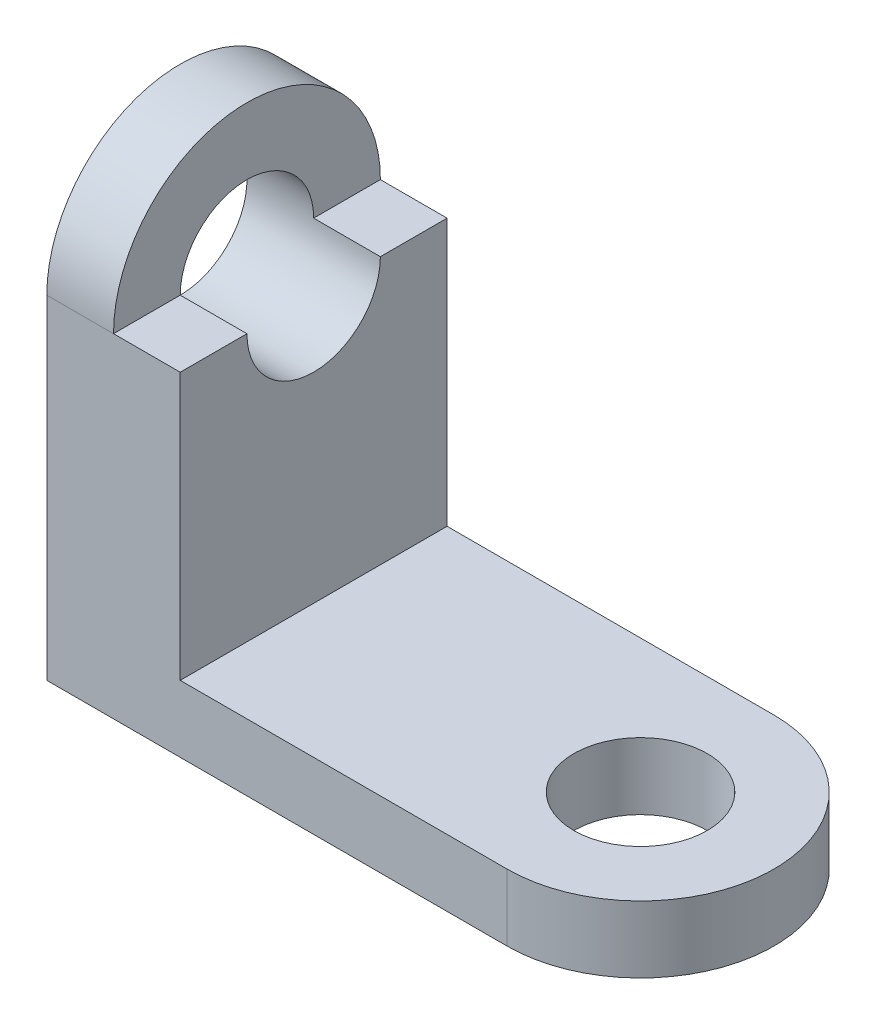
ISO-10303-21;
HEADER;
FILE_DESCRIPTION(('STEP AP214'),'2;1');
FILE_NAME('part.step','',(''),(''),'','','');
FILE_SCHEMA(('AUTOMOTIVE_DESIGN { 1 0 10303 214 1 1 1 1 }'));
ENDSEC;
DATA;
#1=APPLICATION_CONTEXT('core data for automotive mechanical design processes');
#2=APPLICATION_PROTOCOL_DEFINITION('international standard','automotive_design',2000,#1);
#3=PRODUCT_CONTEXT('',#1,'mechanical');
#4=PRODUCT('Part','Part','',(#3));
#5=PRODUCT_RELATED_PRODUCT_CATEGORY('part','',(#4));
#6=PRODUCT_DEFINITION_FORMATION('','',#4);
#7=PRODUCT_DEFINITION_CONTEXT('part definition',#1,'design');
#8=PRODUCT_DEFINITION('design','',#6,#7);
#9=PRODUCT_DEFINITION_SHAPE('','',#8);
#10=(LENGTH_UNIT() NAMED_UNIT(*) SI_UNIT(.MILLI.,.METRE.));
#11=(NAMED_UNIT(*) PLANE_ANGLE_UNIT() SI_UNIT($,.RADIAN.));
#12=(NAMED_UNIT(*) SI_UNIT($,.STERADIAN.) SOLID_ANGLE_UNIT());
#13=UNCERTAINTY_MEASURE_WITH_UNIT(LENGTH_MEASURE(1.E-05),#10,'distance_accuracy_value','');
#14=(GEOMETRIC_REPRESENTATION_CONTEXT(3) GLOBAL_UNCERTAINTY_ASSIGNED_CONTEXT((#13)) GLOBAL_UNIT_ASSIGNED_CONTEXT((#10,
#11,#12)) REPRESENTATION_CONTEXT('',''));
#15=CARTESIAN_POINT('',(0.,0.,0.));
#16=DIRECTION('',(0.,0.,1.));
#17=DIRECTION('',(1.,0.,0.));
#18=AXIS2_PLACEMENT_3D('',#15,#16,#17);
#19=CARTESIAN_POINT('',(254.,0.,0.));
#20=DIRECTION('',(-1.,0.,0.));
#21=DIRECTION('',(0.,0.,1.));
#22=AXIS2_PLACEMENT_3D('',#19,#20,#21);
#23=PLANE('',#22);
#24=DIRECTION('',(0.,0.,1.));
#25=VECTOR('',#24,1.);
#26=CARTESIAN_POINT('',(254.,1270.,-1016.));
#27=LINE('',#26,#25);
#28=CARTESIAN_POINT('',(254.,1270.,-1016.));
#29=VERTEX_POINT('',#28);
#30=CARTESIAN_POINT('',(254.,1270.,-762.));
#31=VERTEX_POINT('',#30);
#32=EDGE_CURVE('E137',#29,#31,#27,.T.);
#33=ORIENTED_EDGE('',*,*,#32,.F.);
#34=CARTESIAN_POINT('',(254.,1270.,-508.));
#35=DIRECTION('',(-1.,0.,0.));
#36=DIRECTION('',(0.,0.,1.));
#37=AXIS2_PLACEMENT_3D('',#34,#35,#36);
#38=CIRCLE('',#37,508.);
#39=CARTESIAN_POINT('',(254.,1270.,0.));
#40=VERTEX_POINT('',#39);
#41=EDGE_CURVE('E151',#29,#40,#38,.F.);
#42=ORIENTED_EDGE('',*,*,#41,.T.);
#43=DIRECTION('',(0.,0.,1.));
#44=VECTOR('',#43,1.);
#45=CARTESIAN_POINT('',(254.,1270.,0.));
#46=LINE('',#45,#44);
#47=CARTESIAN_POINT('',(254.,1270.,-254.));
#48=VERTEX_POINT('',#47);
#49=EDGE_CURVE('E139',#48,#40,#46,.T.);
#50=ORIENTED_EDGE('',*,*,#49,.F.);
#51=CARTESIAN_POINT('',(254.,1270.,-508.));
#52=DIRECTION('',(-1.,0.,0.));
#53=DIRECTION('',(0.,0.,1.));
#54=AXIS2_PLACEMENT_3D('',#51,#52,#53);
#55=CIRCLE('',#54,254.);
#56=EDGE_CURVE('E149',#48,#31,#55,.T.);
#57=ORIENTED_EDGE('',*,*,#56,.T.);
#58=EDGE_LOOP('',(#33,#42,#50,#57));
#59=FACE_BOUND('',#58,.T.);
#60=ADVANCED_FACE('F37',(#59),#23,.F.);
#61=CARTESIAN_POINT('',(1752.6,254.,-508.));
#62=DIRECTION('',(0.,-1.,0.));
#63=DIRECTION('',(0.,0.,-1.));
#64=AXIS2_PLACEMENT_3D('',#61,#62,#63);
#65=PLANE('',#64);
#66=CARTESIAN_POINT('',(1752.6,254.,-508.));
#67=DIRECTION('',(0.,1.,0.));
#68=DIRECTION('',(0.,0.,1.));
#69=AXIS2_PLACEMENT_3D('',#66,#67,#68);
#70=CIRCLE('',#69,254.);
#71=CARTESIAN_POINT('',(1752.6,254.,-254.));
#72=VERTEX_POINT('',#71);
#73=EDGE_CURVE('E164',#72,#72,#70,.T.);
#74=ORIENTED_EDGE('',*,*,#73,.F.);
#75=EDGE_LOOP('',(#74));
#76=FACE_BOUND('',#75,.T.);
#77=DIRECTION('',(-1.,0.,0.));
#78=VECTOR('',#77,1.);
#79=CARTESIAN_POINT('',(0.,254.,-1016.));
#80=LINE('',#79,#78);
#81=CARTESIAN_POINT('',(1752.6,254.,-1016.));
#82=VERTEX_POINT('',#81);
#83=CARTESIAN_POINT('',(508.,254.,-1016.));
#84=VERTEX_POINT('',#83);
#85=EDGE_CURVE('E57',#82,#84,#80,.T.);
#86=ORIENTED_EDGE('',*,*,#85,.T.);
#87=DIRECTION('',(0.,0.,-1.));
#88=VECTOR('',#87,1.);
#89=CARTESIAN_POINT('',(508.,254.,0.));
#90=LINE('',#89,#88);
#91=CARTESIAN_POINT('',(508.,254.,0.));
#92=VERTEX_POINT('',#91);
#93=EDGE_CURVE('E52',#92,#84,#90,.T.);
#94=ORIENTED_EDGE('',*,*,#93,.F.);
#95=DIRECTION('',(1.,0.,0.));
#96=VECTOR('',#95,1.);
#97=CARTESIAN_POINT('',(0.,254.,0.));
#98=LINE('',#97,#96);
#99=CARTESIAN_POINT('',(1752.6,254.,0.));
#100=VERTEX_POINT('',#99);
#101=EDGE_CURVE('E170',#92,#100,#98,.T.);
#102=ORIENTED_EDGE('',*,*,#101,.T.);
#103=CARTESIAN_POINT('',(1752.6,254.,-508.));
#104=DIRECTION('',(0.,1.,0.));
#105=DIRECTION('',(0.,0.,-1.));
#106=AXIS2_PLACEMENT_3D('',#103,#104,#105);
#107=CIRCLE('',#106,508.);
#108=EDGE_CURVE('E172',#100,#82,#107,.T.);
#109=ORIENTED_EDGE('',*,*,#108,.T.);
#110=EDGE_LOOP('',(#86,#94,#102,#109));
#111=FACE_BOUND('',#110,.T.);
#112=ADVANCED_FACE('F218',(#76,#111),#65,.F.);
#113=CARTESIAN_POINT('',(1752.6,0.,-508.));
#114=DIRECTION('',(0.,-1.,0.));
#115=DIRECTION('',(0.,0.,-1.));
#116=AXIS2_PLACEMENT_3D('',#113,#114,#115);
#117=PLANE('',#116);
#118=DIRECTION('',(1.,0.,0.));
#119=VECTOR('',#118,1.);
#120=CARTESIAN_POINT('',(0.,0.,0.));
#121=LINE('',#120,#119);
#122=CARTESIAN_POINT('',(0.,0.,0.));
#123=VERTEX_POINT('',#122);
#124=CARTESIAN_POINT('',(1752.6,0.,0.));
#125=VERTEX_POINT('',#124);
#126=EDGE_CURVE('E167',#123,#125,#121,.T.);
#127=ORIENTED_EDGE('',*,*,#126,.F.);
#128=DIRECTION('',(0.,0.,1.));
#129=VECTOR('',#128,1.);
#130=CARTESIAN_POINT('',(0.,0.,0.));
#131=LINE('',#130,#129);
#132=CARTESIAN_POINT('',(0.,0.,-1016.));
#133=VERTEX_POINT('',#132);
#134=EDGE_CURVE('E173',#133,#123,#131,.T.);
#135=ORIENTED_EDGE('',*,*,#134,.F.);
#136=DIRECTION('',(-1.,0.,0.));
#137=VECTOR('',#136,1.);
#138=CARTESIAN_POINT('',(0.,0.,-1016.));
#139=LINE('',#138,#137);
#140=CARTESIAN_POINT('',(1752.6,0.,-1016.));
#141=VERTEX_POINT('',#140);
#142=EDGE_CURVE('E181',#141,#133,#139,.T.);
#143=ORIENTED_EDGE('',*,*,#142,.F.);
#144=CARTESIAN_POINT('',(1752.6,0.,-508.));
#145=DIRECTION('',(0.,1.,0.));
#146=DIRECTION('',(0.,0.,-1.));
#147=AXIS2_PLACEMENT_3D('',#144,#145,#146);
#148=CIRCLE('',#147,508.);
#149=EDGE_CURVE('E179',#125,#141,#148,.T.);
#150=ORIENTED_EDGE('',*,*,#149,.F.);
#151=EDGE_LOOP('',(#127,#135,#143,#150));
#152=FACE_BOUND('',#151,.T.);
#153=CARTESIAN_POINT('',(1752.6,0.,-508.));
#154=DIRECTION('',(0.,1.,0.));
#155=DIRECTION('',(0.,0.,1.));
#156=AXIS2_PLACEMENT_3D('',#153,#154,#155);
#157=CIRCLE('',#156,254.);
#158=CARTESIAN_POINT('',(1752.6,0.,-254.));
#159=VERTEX_POINT('',#158);
#160=EDGE_CURVE('E162',#159,#159,#157,.T.);
#161=ORIENTED_EDGE('',*,*,#160,.T.);
#162=EDGE_LOOP('',(#161));
#163=FACE_BOUND('',#162,.T.);
#164=ADVANCED_FACE('F196',(#152,#163),#117,.T.);
#165=CARTESIAN_POINT('',(0.,254.,0.));
#166=DIRECTION('',(0.,0.,-1.));
#167=DIRECTION('',(-1.,0.,0.));
#168=AXIS2_PLACEMENT_3D('',#165,#166,#167);
#169=PLANE('',#168);
#170=ORIENTED_EDGE('',*,*,#101,.F.);
#171=DIRECTION('',(0.,-1.,0.));
#172=VECTOR('',#171,1.);
#173=CARTESIAN_POINT('',(508.,1270.,0.));
#174=LINE('',#173,#172);
#175=CARTESIAN_POINT('',(508.,1270.,0.));
#176=VERTEX_POINT('',#175);
#177=EDGE_CURVE('E142',#176,#92,#174,.T.);
#178=ORIENTED_EDGE('',*,*,#177,.F.);
#179=DIRECTION('',(-1.,0.,0.));
#180=VECTOR('',#179,1.);
#181=CARTESIAN_POINT('',(508.,1270.,0.));
#182=LINE('',#181,#180);
#183=EDGE_CURVE('E136',#176,#40,#182,.T.);
#184=ORIENTED_EDGE('',*,*,#183,.T.);
#185=DIRECTION('',(-1.,0.,0.));
#186=VECTOR('',#185,1.);
#187=CARTESIAN_POINT('',(254.,1270.,0.));
#188=LINE('',#187,#186);
#189=CARTESIAN_POINT('',(0.,1270.,0.));
#190=VERTEX_POINT('',#189);
#191=EDGE_CURVE('E159',#40,#190,#188,.T.);
#192=ORIENTED_EDGE('',*,*,#191,.T.);
#193=DIRECTION('',(0.,-1.,0.));
#194=VECTOR('',#193,1.);
#195=CARTESIAN_POINT('',(0.,254.,0.));
#196=LINE('',#195,#194);
#197=EDGE_CURVE('E176',#190,#123,#196,.T.);
#198=ORIENTED_EDGE('',*,*,#197,.T.);
#199=ORIENTED_EDGE('',*,*,#126,.T.);
#200=DIRECTION('',(0.,-1.,0.));
#201=VECTOR('',#200,1.);
#202=CARTESIAN_POINT('',(1752.6,254.,0.));
#203=LINE('',#202,#201);
#204=EDGE_CURVE('E11',#100,#125,#203,.T.);
#205=ORIENTED_EDGE('',*,*,#204,.F.);
#206=EDGE_LOOP('',(#170,#178,#184,#192,#198,#199,#205));
#207=FACE_BOUND('',#206,.T.);
#208=ADVANCED_FACE('F39',(#207),#169,.F.);
#209=CARTESIAN_POINT('',(1752.6,254.,-508.));
#210=DIRECTION('',(0.,-1.,0.));
#211=DIRECTION('',(0.,0.,-1.));
#212=AXIS2_PLACEMENT_3D('',#209,#210,#211);
#213=CYLINDRICAL_SURFACE('',#212,508.);
#214=ORIENTED_EDGE('',*,*,#149,.T.);
#215=DIRECTION('',(0.,-1.,0.));
#216=VECTOR('',#215,1.);
#217=CARTESIAN_POINT('',(1752.6,254.,-1016.));
#218=LINE('',#217,#216);
#219=EDGE_CURVE('E45',#82,#141,#218,.T.);
#220=ORIENTED_EDGE('',*,*,#219,.F.);
#221=ORIENTED_EDGE('',*,*,#108,.F.);
#222=ORIENTED_EDGE('',*,*,#204,.T.);
#223=EDGE_LOOP('',(#214,#220,#221,#222));
#224=FACE_BOUND('',#223,.T.);
#225=ADVANCED_FACE('F219',(#224),#213,.T.);
#226=CARTESIAN_POINT('',(0.,254.,-1016.));
#227=DIRECTION('',(0.,0.,1.));
#228=DIRECTION('',(1.,0.,0.));
#229=AXIS2_PLACEMENT_3D('',#226,#227,#228);
#230=PLANE('',#229);
#231=ORIENTED_EDGE('',*,*,#142,.T.);
#232=DIRECTION('',(0.,-1.,0.));
#233=VECTOR('',#232,1.);
#234=CARTESIAN_POINT('',(0.,254.,-1016.));
#235=LINE('',#234,#233);
#236=CARTESIAN_POINT('',(0.,1270.,-1016.));
#237=VERTEX_POINT('',#236);
#238=EDGE_CURVE('E186',#237,#133,#235,.T.);
#239=ORIENTED_EDGE('',*,*,#238,.F.);
#240=DIRECTION('',(-1.,0.,0.));
#241=VECTOR('',#240,1.);
#242=CARTESIAN_POINT('',(254.,1270.,-1016.));
#243=LINE('',#242,#241);
#244=EDGE_CURVE('E119',#29,#237,#243,.T.);
#245=ORIENTED_EDGE('',*,*,#244,.F.);
#246=DIRECTION('',(-1.,0.,0.));
#247=VECTOR('',#246,1.);
#248=CARTESIAN_POINT('',(508.,1270.,-1016.));
#249=LINE('',#248,#247);
#250=CARTESIAN_POINT('',(508.,1270.,-1016.));
#251=VERTEX_POINT('',#250);
#252=EDGE_CURVE('E116',#251,#29,#249,.T.);
#253=ORIENTED_EDGE('',*,*,#252,.F.);
#254=DIRECTION('',(0.,1.,0.));
#255=VECTOR('',#254,1.);
#256=CARTESIAN_POINT('',(508.,254.,-1016.));
#257=LINE('',#256,#255);
#258=EDGE_CURVE('E105',#84,#251,#257,.T.);
#259=ORIENTED_EDGE('',*,*,#258,.F.);
#260=ORIENTED_EDGE('',*,*,#85,.F.);
#261=ORIENTED_EDGE('',*,*,#219,.T.);
#262=EDGE_LOOP('',(#231,#239,#245,#253,#259,#260,#261));
#263=FACE_BOUND('',#262,.T.);
#264=ADVANCED_FACE('F117',(#263),#230,.F.);
#265=CARTESIAN_POINT('',(0.,254.,0.));
#266=DIRECTION('',(1.,0.,0.));
#267=DIRECTION('',(0.,0.,-1.));
#268=AXIS2_PLACEMENT_3D('',#265,#266,#267);
#269=PLANE('',#268);
#270=ORIENTED_EDGE('',*,*,#134,.T.);
#271=ORIENTED_EDGE('',*,*,#197,.F.);
#272=CARTESIAN_POINT('',(0.,1270.,-508.));
#273=DIRECTION('',(-1.,0.,0.));
#274=DIRECTION('',(0.,0.,1.));
#275=AXIS2_PLACEMENT_3D('',#272,#273,#274);
#276=CIRCLE('',#275,508.);
#277=EDGE_CURVE('E152',#237,#190,#276,.F.);
#278=ORIENTED_EDGE('',*,*,#277,.F.);
#279=ORIENTED_EDGE('',*,*,#238,.T.);
#280=EDGE_LOOP('',(#270,#271,#278,#279));
#281=FACE_BOUND('',#280,.T.);
#282=CARTESIAN_POINT('',(0.,1270.,-508.));
#283=DIRECTION('',(-1.,0.,0.));
#284=DIRECTION('',(0.,0.,1.));
#285=AXIS2_PLACEMENT_3D('',#282,#283,#284);
#286=CIRCLE('',#285,254.);
#287=CARTESIAN_POINT('',(0.,1270.,-254.));
#288=VERTEX_POINT('',#287);
#289=EDGE_CURVE('E123',#288,#288,#286,.T.);
#290=ORIENTED_EDGE('',*,*,#289,.F.);
#291=EDGE_LOOP('',(#290));
#292=FACE_BOUND('',#291,.T.);
#293=ADVANCED_FACE('F199',(#281,#292),#269,.F.);
#294=CARTESIAN_POINT('',(1752.6,254.,-508.));
#295=DIRECTION('',(0.,-1.,0.));
#296=DIRECTION('',(0.,0.,-1.));
#297=AXIS2_PLACEMENT_3D('',#294,#295,#296);
#298=CYLINDRICAL_SURFACE('',#297,254.);
#299=ORIENTED_EDGE('',*,*,#73,.T.);
#300=EDGE_LOOP('',(#299));
#301=FACE_BOUND('',#300,.T.);
#302=ORIENTED_EDGE('',*,*,#160,.F.);
#303=EDGE_LOOP('',(#302));
#304=FACE_BOUND('',#303,.T.);
#305=ADVANCED_FACE('F241',(#301,#304),#298,.F.);
#306=CARTESIAN_POINT('',(254.,1270.,-508.));
#307=DIRECTION('',(-1.,0.,0.));
#308=DIRECTION('',(0.,0.,1.));
#309=AXIS2_PLACEMENT_3D('',#306,#307,#308);
#310=CYLINDRICAL_SURFACE('',#309,508.);
#311=ORIENTED_EDGE('',*,*,#277,.T.);
#312=ORIENTED_EDGE('',*,*,#191,.F.);
#313=ORIENTED_EDGE('',*,*,#41,.F.);
#314=ORIENTED_EDGE('',*,*,#244,.T.);
#315=EDGE_LOOP('',(#311,#312,#313,#314));
#316=FACE_BOUND('',#315,.T.);
#317=ADVANCED_FACE('F207',(#316),#310,.T.);
#318=CARTESIAN_POINT('',(254.,1270.,-508.));
#319=DIRECTION('',(-1.,0.,0.));
#320=DIRECTION('',(0.,0.,1.));
#321=AXIS2_PLACEMENT_3D('',#318,#319,#320);
#322=CYLINDRICAL_SURFACE('',#321,254.);
#323=ORIENTED_EDGE('',*,*,#56,.F.);
#324=DIRECTION('',(-1.,0.,0.));
#325=VECTOR('',#324,1.);
#326=CARTESIAN_POINT('',(508.,1270.,-254.));
#327=LINE('',#326,#325);
#328=CARTESIAN_POINT('',(508.,1270.,-254.));
#329=VERTEX_POINT('',#328);
#330=EDGE_CURVE('E145',#329,#48,#327,.T.);
#331=ORIENTED_EDGE('',*,*,#330,.F.);
#332=CARTESIAN_POINT('',(508.,1270.,-508.));
#333=DIRECTION('',(-1.,0.,0.));
#334=DIRECTION('',(0.,0.,-1.));
#335=AXIS2_PLACEMENT_3D('',#332,#333,#334);
#336=CIRCLE('',#335,254.);
#337=CARTESIAN_POINT('',(508.,1270.,-762.));
#338=VERTEX_POINT('',#337);
#339=EDGE_CURVE('E129',#338,#329,#336,.T.);
#340=ORIENTED_EDGE('',*,*,#339,.F.);
#341=DIRECTION('',(-1.,0.,0.));
#342=VECTOR('',#341,1.);
#343=CARTESIAN_POINT('',(508.,1270.,-762.));
#344=LINE('',#343,#342);
#345=EDGE_CURVE('E124',#338,#31,#344,.T.);
#346=ORIENTED_EDGE('',*,*,#345,.T.);
#347=EDGE_LOOP('',(#323,#331,#340,#346));
#348=FACE_BOUND('',#347,.T.);
#349=ORIENTED_EDGE('',*,*,#289,.T.);
#350=EDGE_LOOP('',(#349));
#351=FACE_BOUND('',#350,.T.);
#352=ADVANCED_FACE('F215',(#348,#351),#322,.F.);
#353=CARTESIAN_POINT('',(508.,1270.,-1016.));
#354=DIRECTION('',(0.,-1.,0.));
#355=DIRECTION('',(0.,0.,-1.));
#356=AXIS2_PLACEMENT_3D('',#353,#354,#355);
#357=PLANE('',#356);
#358=ORIENTED_EDGE('',*,*,#32,.T.);
#359=ORIENTED_EDGE('',*,*,#345,.F.);
#360=DIRECTION('',(0.,0.,1.));
#361=VECTOR('',#360,1.);
#362=CARTESIAN_POINT('',(508.,1270.,-1016.));
#363=LINE('',#362,#361);
#364=EDGE_CURVE('E110',#251,#338,#363,.T.);
#365=ORIENTED_EDGE('',*,*,#364,.F.);
#366=ORIENTED_EDGE('',*,*,#252,.T.);
#367=EDGE_LOOP('',(#358,#359,#365,#366));
#368=FACE_BOUND('',#367,.T.);
#369=ADVANCED_FACE('F126',(#368),#357,.F.);
#370=CARTESIAN_POINT('',(508.,1270.,0.));
#371=DIRECTION('',(0.,-1.,0.));
#372=DIRECTION('',(0.,0.,-1.));
#373=AXIS2_PLACEMENT_3D('',#370,#371,#372);
#374=PLANE('',#373);
#375=ORIENTED_EDGE('',*,*,#49,.T.);
#376=ORIENTED_EDGE('',*,*,#183,.F.);
#377=DIRECTION('',(0.,0.,1.));
#378=VECTOR('',#377,1.);
#379=CARTESIAN_POINT('',(508.,1270.,0.));
#380=LINE('',#379,#378);
#381=EDGE_CURVE('E131',#329,#176,#380,.T.);
#382=ORIENTED_EDGE('',*,*,#381,.F.);
#383=ORIENTED_EDGE('',*,*,#330,.T.);
#384=EDGE_LOOP('',(#375,#376,#382,#383));
#385=FACE_BOUND('',#384,.T.);
#386=ADVANCED_FACE('F211',(#385),#374,.F.);
#387=CARTESIAN_POINT('',(508.,1270.,-508.));
#388=DIRECTION('',(1.,0.,0.));
#389=DIRECTION('',(0.,0.,-1.));
#390=AXIS2_PLACEMENT_3D('',#387,#388,#389);
#391=PLANE('',#390);
#392=ORIENTED_EDGE('',*,*,#177,.T.);
#393=ORIENTED_EDGE('',*,*,#93,.T.);
#394=ORIENTED_EDGE('',*,*,#258,.T.);
#395=ORIENTED_EDGE('',*,*,#364,.T.);
#396=ORIENTED_EDGE('',*,*,#339,.T.);
#397=ORIENTED_EDGE('',*,*,#381,.T.);
#398=EDGE_LOOP('',(#392,#393,#394,#395,#396,#397));
#399=FACE_BOUND('',#398,.T.);
#400=ADVANCED_FACE('F108',(#399),#391,.T.);
#401=CLOSED_SHELL('',(#60,#112,#164,#208,#225,#264,#293,#305,#317,#352,#369,#386,#400));
#402=MANIFOLD_SOLID_BREP('B2',#401);
#403=ADVANCED_BREP_SHAPE_REPRESENTATION('',(#18,#402),#14);
#404=SHAPE_DEFINITION_REPRESENTATION(#9,#403);
ENDSEC;
END-ISO-10303-21;
